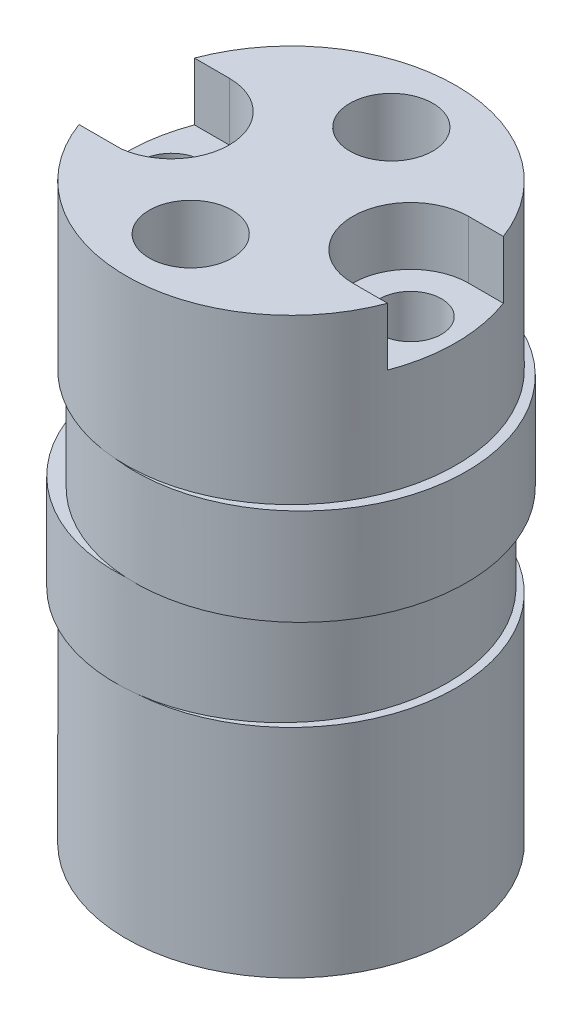
ISO-10303-21;
HEADER;
FILE_DESCRIPTION(('STEP AP214'),'2;1');
FILE_NAME('part.step','',(''),(''),'','','');
FILE_SCHEMA(('AUTOMOTIVE_DESIGN { 1 0 10303 214 1 1 1 1 }'));
ENDSEC;
DATA;
#1=APPLICATION_CONTEXT('core data for automotive mechanical design processes');
#2=APPLICATION_PROTOCOL_DEFINITION('international standard','automotive_design',2000,#1);
#3=PRODUCT_CONTEXT('',#1,'mechanical');
#4=PRODUCT('Part','Part','',(#3));
#5=PRODUCT_RELATED_PRODUCT_CATEGORY('part','',(#4));
#6=PRODUCT_DEFINITION_FORMATION('','',#4);
#7=PRODUCT_DEFINITION_CONTEXT('part definition',#1,'design');
#8=PRODUCT_DEFINITION('design','',#6,#7);
#9=PRODUCT_DEFINITION_SHAPE('','',#8);
#10=(LENGTH_UNIT() NAMED_UNIT(*) SI_UNIT(.MILLI.,.METRE.));
#11=(NAMED_UNIT(*) PLANE_ANGLE_UNIT() SI_UNIT($,.RADIAN.));
#12=(NAMED_UNIT(*) SI_UNIT($,.STERADIAN.) SOLID_ANGLE_UNIT());
#13=UNCERTAINTY_MEASURE_WITH_UNIT(LENGTH_MEASURE(1.E-05),#10,'distance_accuracy_value','');
#14=(GEOMETRIC_REPRESENTATION_CONTEXT(3) GLOBAL_UNCERTAINTY_ASSIGNED_CONTEXT((#13)) GLOBAL_UNIT_ASSIGNED_CONTEXT((#10,
#11,#12)) REPRESENTATION_CONTEXT('',''));
#15=CARTESIAN_POINT('',(0.,0.,0.));
#16=DIRECTION('',(0.,0.,1.));
#17=DIRECTION('',(1.,0.,0.));
#18=AXIS2_PLACEMENT_3D('',#15,#16,#17);
#19=CARTESIAN_POINT('',(6.7,-15.7754833995939,0.));
#20=DIRECTION('',(0.,1.,0.));
#21=DIRECTION('',(0.,0.,1.));
#22=AXIS2_PLACEMENT_3D('',#19,#20,#21);
#23=CYLINDRICAL_SURFACE('',#22,1.6);
#24=CARTESIAN_POINT('',(6.7,-11.25,0.));
#25=DIRECTION('',(0.,-1.,0.));
#26=DIRECTION('',(0.,0.,-1.));
#27=AXIS2_PLACEMENT_3D('',#24,#25,#26);
#28=CIRCLE('',#27,1.6);
#29=CARTESIAN_POINT('',(6.7,-11.25,-1.6));
#30=VERTEX_POINT('',#29);
#31=EDGE_CURVE('E214',#30,#30,#28,.F.);
#32=ORIENTED_EDGE('',*,*,#31,.F.);
#33=EDGE_LOOP('',(#32));
#34=FACE_BOUND('',#33,.T.);
#35=CARTESIAN_POINT('',(6.7,15.5,0.));
#36=DIRECTION('',(0.,1.,0.));
#37=DIRECTION('',(0.,0.,1.));
#38=AXIS2_PLACEMENT_3D('',#35,#36,#37);
#39=CIRCLE('',#38,1.6);
#40=CARTESIAN_POINT('',(6.7,15.5,1.6));
#41=VERTEX_POINT('',#40);
#42=EDGE_CURVE('E43',#41,#41,#39,.F.);
#43=ORIENTED_EDGE('',*,*,#42,.F.);
#44=EDGE_LOOP('',(#43));
#45=FACE_BOUND('',#44,.T.);
#46=ADVANCED_FACE('F39',(#34,#45),#23,.F.);
#47=CARTESIAN_POINT('',(-5.7,-15.7754833995939,0.));
#48=DIRECTION('',(0.,1.,0.));
#49=DIRECTION('',(0.,0.,1.));
#50=AXIS2_PLACEMENT_3D('',#47,#48,#49);
#51=CYLINDRICAL_SURFACE('',#50,1.6);
#52=CARTESIAN_POINT('',(-5.7,-11.25,0.));
#53=DIRECTION('',(0.,-1.,0.));
#54=DIRECTION('',(0.,0.,-1.));
#55=AXIS2_PLACEMENT_3D('',#52,#53,#54);
#56=CIRCLE('',#55,1.6);
#57=CARTESIAN_POINT('',(-5.7,-11.25,-1.6));
#58=VERTEX_POINT('',#57);
#59=EDGE_CURVE('E203',#58,#58,#56,.F.);
#60=ORIENTED_EDGE('',*,*,#59,.F.);
#61=EDGE_LOOP('',(#60));
#62=FACE_BOUND('',#61,.T.);
#63=CARTESIAN_POINT('',(-5.7,15.5,0.));
#64=DIRECTION('',(0.,1.,0.));
#65=DIRECTION('',(0.,0.,1.));
#66=AXIS2_PLACEMENT_3D('',#63,#64,#65);
#67=CIRCLE('',#66,1.6);
#68=CARTESIAN_POINT('',(-5.7,15.5,1.6));
#69=VERTEX_POINT('',#68);
#70=EDGE_CURVE('E154',#69,#69,#67,.F.);
#71=ORIENTED_EDGE('',*,*,#70,.F.);
#72=EDGE_LOOP('',(#71));
#73=FACE_BOUND('',#72,.T.);
#74=ADVANCED_FACE('F252',(#62,#73),#51,.F.);
#75=CARTESIAN_POINT('',(0.,5.,0.));
#76=DIRECTION('',(0.,-1.,0.));
#77=DIRECTION('',(0.,0.,-1.));
#78=AXIS2_PLACEMENT_3D('',#75,#76,#77);
#79=CYLINDRICAL_SURFACE('',#78,8.6);
#80=CARTESIAN_POINT('',(0.,5.,0.));
#81=DIRECTION('',(0.,1.,0.));
#82=DIRECTION('',(0.,0.,1.));
#83=AXIS2_PLACEMENT_3D('',#80,#81,#82);
#84=CIRCLE('',#83,8.6);
#85=CARTESIAN_POINT('',(0.500000000000015,5.,8.58545281275251));
#86=VERTEX_POINT('',#85);
#87=CARTESIAN_POINT('',(0.500000000000015,5.,-8.58545281275251));
#88=VERTEX_POINT('',#87);
#89=EDGE_CURVE('E243',#86,#88,#84,.T.);
#90=ORIENTED_EDGE('',*,*,#89,.F.);
#91=EDGE_CURVE('E246',#88,#86,#84,.T.);
#92=ORIENTED_EDGE('',*,*,#91,.F.);
#93=EDGE_LOOP('',(#90,#92));
#94=FACE_BOUND('',#93,.T.);
#95=CARTESIAN_POINT('',(0.,0.,0.));
#96=DIRECTION('',(0.,1.,0.));
#97=DIRECTION('',(0.,0.,1.));
#98=AXIS2_PLACEMENT_3D('',#95,#96,#97);
#99=CIRCLE('',#98,8.6);
#100=CARTESIAN_POINT('',(1.10749999999999,0.,8.52839045482792));
#101=VERTEX_POINT('',#100);
#102=CARTESIAN_POINT('',(1.10749999999999,0.,-8.52839045482792));
#103=VERTEX_POINT('',#102);
#104=EDGE_CURVE('E247',#101,#103,#99,.T.);
#105=ORIENTED_EDGE('',*,*,#104,.T.);
#106=EDGE_CURVE('E238',#103,#101,#99,.T.);
#107=ORIENTED_EDGE('',*,*,#106,.T.);
#108=EDGE_LOOP('',(#105,#107));
#109=FACE_BOUND('',#108,.T.);
#110=ADVANCED_FACE('F41',(#94,#109),#79,.T.);
#111=CARTESIAN_POINT('',(0.,5.,0.));
#112=DIRECTION('',(0.,1.,0.));
#113=DIRECTION('',(0.,0.,1.));
#114=AXIS2_PLACEMENT_3D('',#111,#112,#113);
#115=PLANE('',#114);
#116=CARTESIAN_POINT('',(1.,5.,0.));
#117=DIRECTION('',(0.,1.,0.));
#118=DIRECTION('',(0.,0.,1.));
#119=AXIS2_PLACEMENT_3D('',#116,#117,#118);
#120=CIRCLE('',#119,8.6);
#121=EDGE_CURVE('E240',#88,#86,#120,.T.);
#122=ORIENTED_EDGE('',*,*,#121,.F.);
#123=ORIENTED_EDGE('',*,*,#91,.T.);
#124=EDGE_LOOP('',(#122,#123));
#125=FACE_BOUND('',#124,.T.);
#126=ADVANCED_FACE('F261',(#125),#115,.T.);
#127=CARTESIAN_POINT('',(0.,0.,0.));
#128=DIRECTION('',(0.,1.,0.));
#129=DIRECTION('',(0.,0.,1.));
#130=AXIS2_PLACEMENT_3D('',#127,#128,#129);
#131=PLANE('',#130);
#132=CARTESIAN_POINT('',(0.5,0.,0.));
#133=DIRECTION('',(0.,-1.,0.));
#134=DIRECTION('',(0.,0.,-1.));
#135=AXIS2_PLACEMENT_3D('',#132,#133,#134);
#136=CIRCLE('',#135,8.55);
#137=EDGE_CURVE('E11',#101,#103,#136,.T.);
#138=ORIENTED_EDGE('',*,*,#137,.F.);
#139=ORIENTED_EDGE('',*,*,#106,.F.);
#140=EDGE_LOOP('',(#138,#139));
#141=FACE_BOUND('',#140,.T.);
#142=ADVANCED_FACE('F313',(#141),#131,.F.);
#143=CARTESIAN_POINT('',(1.,5.,0.));
#144=DIRECTION('',(0.,1.,0.));
#145=DIRECTION('',(0.,0.,1.));
#146=AXIS2_PLACEMENT_3D('',#143,#144,#145);
#147=PLANE('',#146);
#148=EDGE_CURVE('E234',#86,#88,#120,.T.);
#149=ORIENTED_EDGE('',*,*,#148,.F.);
#150=ORIENTED_EDGE('',*,*,#89,.T.);
#151=EDGE_LOOP('',(#149,#150));
#152=FACE_BOUND('',#151,.T.);
#153=ADVANCED_FACE('F310',(#152),#147,.F.);
#154=CARTESIAN_POINT('',(1.,10.,0.));
#155=DIRECTION('',(0.,-1.,0.));
#156=DIRECTION('',(0.,0.,-1.));
#157=AXIS2_PLACEMENT_3D('',#154,#155,#156);
#158=CYLINDRICAL_SURFACE('',#157,8.6);
#159=CARTESIAN_POINT('',(1.,10.,0.));
#160=DIRECTION('',(0.,1.,0.));
#161=DIRECTION('',(0.,0.,1.));
#162=AXIS2_PLACEMENT_3D('',#159,#160,#161);
#163=CIRCLE('',#162,8.6);
#164=CARTESIAN_POINT('',(-0.107499999999965,10.,-8.52839045482792));
#165=VERTEX_POINT('',#164);
#166=CARTESIAN_POINT('',(-0.107499999999965,10.,8.52839045482792));
#167=VERTEX_POINT('',#166);
#168=EDGE_CURVE('E235',#165,#167,#163,.T.);
#169=ORIENTED_EDGE('',*,*,#168,.F.);
#170=EDGE_CURVE('E239',#167,#165,#163,.T.);
#171=ORIENTED_EDGE('',*,*,#170,.F.);
#172=EDGE_LOOP('',(#169,#171));
#173=FACE_BOUND('',#172,.T.);
#174=ORIENTED_EDGE('',*,*,#121,.T.);
#175=ORIENTED_EDGE('',*,*,#148,.T.);
#176=EDGE_LOOP('',(#174,#175));
#177=FACE_BOUND('',#176,.T.);
#178=ADVANCED_FACE('F308',(#173,#177),#158,.T.);
#179=CARTESIAN_POINT('',(1.,10.,0.));
#180=DIRECTION('',(0.,1.,0.));
#181=DIRECTION('',(0.,0.,1.));
#182=AXIS2_PLACEMENT_3D('',#179,#180,#181);
#183=PLANE('',#182);
#184=CARTESIAN_POINT('',(0.5,10.,0.));
#185=DIRECTION('',(0.,1.,0.));
#186=DIRECTION('',(0.,0.,1.));
#187=AXIS2_PLACEMENT_3D('',#184,#185,#186);
#188=CIRCLE('',#187,8.55);
#189=EDGE_CURVE('E48',#167,#165,#188,.T.);
#190=ORIENTED_EDGE('',*,*,#189,.F.);
#191=ORIENTED_EDGE('',*,*,#170,.T.);
#192=EDGE_LOOP('',(#190,#191));
#193=FACE_BOUND('',#192,.T.);
#194=ADVANCED_FACE('F302',(#193),#183,.T.);
#195=CARTESIAN_POINT('',(0.5,10.,0.));
#196=DIRECTION('',(0.,1.,0.));
#197=DIRECTION('',(0.,0.,1.));
#198=AXIS2_PLACEMENT_3D('',#195,#196,#197);
#199=PLANE('',#198);
#200=EDGE_CURVE('E231',#165,#167,#188,.T.);
#201=ORIENTED_EDGE('',*,*,#200,.F.);
#202=ORIENTED_EDGE('',*,*,#168,.T.);
#203=EDGE_LOOP('',(#201,#202));
#204=FACE_BOUND('',#203,.T.);
#205=ADVANCED_FACE('F299',(#204),#199,.F.);
#206=CARTESIAN_POINT('',(0.5,11.,0.));
#207=DIRECTION('',(0.,-1.,0.));
#208=DIRECTION('',(0.,0.,-1.));
#209=AXIS2_PLACEMENT_3D('',#206,#207,#208);
#210=CYLINDRICAL_SURFACE('',#209,8.55);
#211=CARTESIAN_POINT('',(0.5,18.5,0.));
#212=DIRECTION('',(0.,1.,0.));
#213=DIRECTION('',(0.,0.,1.));
#214=AXIS2_PLACEMENT_3D('',#211,#212,#213);
#215=CIRCLE('',#214,8.55);
#216=CARTESIAN_POINT('',(-7.51621514432931,18.5,2.9736837020479));
#217=VERTEX_POINT('',#216);
#218=CARTESIAN_POINT('',(8.50640368704951,18.5,3.));
#219=VERTEX_POINT('',#218);
#220=EDGE_CURVE('E225',#217,#219,#215,.T.);
#221=ORIENTED_EDGE('',*,*,#220,.F.);
#222=DIRECTION('',(0.,-1.,0.));
#223=VECTOR('',#222,1.);
#224=CARTESIAN_POINT('',(-7.51621514432932,11.,2.9736837020479));
#225=LINE('',#224,#223);
#226=CARTESIAN_POINT('',(-7.51621514432931,15.5,2.9736837020479));
#227=VERTEX_POINT('',#226);
#228=EDGE_CURVE('E184',#217,#227,#225,.T.);
#229=ORIENTED_EDGE('',*,*,#228,.T.);
#230=CARTESIAN_POINT('',(0.5,15.5,0.));
#231=DIRECTION('',(0.,1.,0.));
#232=DIRECTION('',(0.,0.,1.));
#233=AXIS2_PLACEMENT_3D('',#230,#231,#232);
#234=CIRCLE('',#233,8.55);
#235=CARTESIAN_POINT('',(-7.50640368704951,15.5,-3.));
#236=VERTEX_POINT('',#235);
#237=EDGE_CURVE('E173',#236,#227,#234,.T.);
#238=ORIENTED_EDGE('',*,*,#237,.F.);
#239=DIRECTION('',(0.,-1.,0.));
#240=VECTOR('',#239,1.);
#241=CARTESIAN_POINT('',(-7.50640368704951,11.,-3.));
#242=LINE('',#241,#240);
#243=CARTESIAN_POINT('',(-7.50640368704951,18.5,-3.));
#244=VERTEX_POINT('',#243);
#245=EDGE_CURVE('E139',#236,#244,#242,.F.);
#246=ORIENTED_EDGE('',*,*,#245,.T.);
#247=CARTESIAN_POINT('',(8.50640368704951,18.5,-3.));
#248=VERTEX_POINT('',#247);
#249=EDGE_CURVE('E230',#248,#244,#215,.T.);
#250=ORIENTED_EDGE('',*,*,#249,.F.);
#251=DIRECTION('',(0.,-1.,0.));
#252=VECTOR('',#251,1.);
#253=CARTESIAN_POINT('',(8.50640368704951,11.,-3.));
#254=LINE('',#253,#252);
#255=CARTESIAN_POINT('',(8.50640368704951,15.5,-3.));
#256=VERTEX_POINT('',#255);
#257=EDGE_CURVE('E180',#248,#256,#254,.T.);
#258=ORIENTED_EDGE('',*,*,#257,.T.);
#259=CARTESIAN_POINT('',(0.5,15.5,0.));
#260=DIRECTION('',(0.,1.,0.));
#261=DIRECTION('',(0.,0.,1.));
#262=AXIS2_PLACEMENT_3D('',#259,#260,#261);
#263=CIRCLE('',#262,8.55);
#264=CARTESIAN_POINT('',(8.50640368704951,15.5,3.));
#265=VERTEX_POINT('',#264);
#266=EDGE_CURVE('E175',#265,#256,#263,.T.);
#267=ORIENTED_EDGE('',*,*,#266,.F.);
#268=DIRECTION('',(0.,-1.,0.));
#269=VECTOR('',#268,1.);
#270=CARTESIAN_POINT('',(8.50640368704951,11.,3.));
#271=LINE('',#270,#269);
#272=EDGE_CURVE('E177',#265,#219,#271,.F.);
#273=ORIENTED_EDGE('',*,*,#272,.T.);
#274=EDGE_LOOP('',(#221,#229,#238,#246,#250,#258,#267,#273));
#275=FACE_BOUND('',#274,.T.);
#276=ORIENTED_EDGE('',*,*,#200,.T.);
#277=ORIENTED_EDGE('',*,*,#189,.T.);
#278=EDGE_LOOP('',(#276,#277));
#279=FACE_BOUND('',#278,.T.);
#280=ADVANCED_FACE('F297',(#275,#279),#210,.T.);
#281=CARTESIAN_POINT('',(0.5,18.5,0.));
#282=DIRECTION('',(0.,1.,0.));
#283=DIRECTION('',(0.,0.,1.));
#284=AXIS2_PLACEMENT_3D('',#281,#282,#283);
#285=PLANE('',#284);
#286=DIRECTION('',(1.,0.,0.));
#287=VECTOR('',#286,1.);
#288=CARTESIAN_POINT('',(-5.30350883972695,18.5,2.9736837020479));
#289=LINE('',#288,#287);
#290=CARTESIAN_POINT('',(-5.30350883972695,18.5,2.9736837020479));
#291=VERTEX_POINT('',#290);
#292=EDGE_CURVE('E146',#217,#291,#289,.T.);
#293=ORIENTED_EDGE('',*,*,#292,.F.);
#294=ORIENTED_EDGE('',*,*,#220,.T.);
#295=DIRECTION('',(1.,0.,0.));
#296=VECTOR('',#295,1.);
#297=CARTESIAN_POINT('',(6.7,18.5,3.));
#298=LINE('',#297,#296);
#299=CARTESIAN_POINT('',(6.7,18.5,3.));
#300=VERTEX_POINT('',#299);
#301=EDGE_CURVE('E163',#300,#219,#298,.T.);
#302=ORIENTED_EDGE('',*,*,#301,.F.);
#303=CARTESIAN_POINT('',(6.7,18.5,0.));
#304=DIRECTION('',(0.,1.,0.));
#305=DIRECTION('',(0.,0.,1.));
#306=AXIS2_PLACEMENT_3D('',#303,#304,#305);
#307=CIRCLE('',#306,3.);
#308=CARTESIAN_POINT('',(6.7,18.5,-3.));
#309=VERTEX_POINT('',#308);
#310=EDGE_CURVE('E65',#309,#300,#307,.T.);
#311=ORIENTED_EDGE('',*,*,#310,.F.);
#312=DIRECTION('',(-1.,0.,0.));
#313=VECTOR('',#312,1.);
#314=CARTESIAN_POINT('',(6.7,18.5,-3.));
#315=LINE('',#314,#313);
#316=EDGE_CURVE('E161',#248,#309,#315,.T.);
#317=ORIENTED_EDGE('',*,*,#316,.F.);
#318=ORIENTED_EDGE('',*,*,#249,.T.);
#319=DIRECTION('',(-1.,0.,0.));
#320=VECTOR('',#319,1.);
#321=CARTESIAN_POINT('',(-5.7,18.5,-3.));
#322=LINE('',#321,#320);
#323=CARTESIAN_POINT('',(-5.7,18.5,-3.));
#324=VERTEX_POINT('',#323);
#325=EDGE_CURVE('E148',#324,#244,#322,.T.);
#326=ORIENTED_EDGE('',*,*,#325,.F.);
#327=CARTESIAN_POINT('',(-5.7,18.5,0.));
#328=DIRECTION('',(0.,1.,0.));
#329=DIRECTION('',(0.,0.,1.));
#330=AXIS2_PLACEMENT_3D('',#327,#328,#329);
#331=CIRCLE('',#330,3.);
#332=EDGE_CURVE('E57',#291,#324,#331,.T.);
#333=ORIENTED_EDGE('',*,*,#332,.F.);
#334=EDGE_LOOP('',(#293,#294,#302,#311,#317,#318,#326,#333));
#335=FACE_BOUND('',#334,.T.);
#336=CARTESIAN_POINT('',(0.3,18.5,5.));
#337=DIRECTION('',(0.,1.,0.));
#338=DIRECTION('',(0.,0.,-1.));
#339=AXIS2_PLACEMENT_3D('',#336,#337,#338);
#340=CIRCLE('',#339,2.15);
#341=CARTESIAN_POINT('',(0.3,18.5,2.85));
#342=VERTEX_POINT('',#341);
#343=EDGE_CURVE('E199',#342,#342,#340,.T.);
#344=ORIENTED_EDGE('',*,*,#343,.F.);
#345=EDGE_LOOP('',(#344));
#346=FACE_BOUND('',#345,.T.);
#347=CARTESIAN_POINT('',(0.7,18.5,-5.));
#348=DIRECTION('',(0.,1.,0.));
#349=DIRECTION('',(0.,0.,1.));
#350=AXIS2_PLACEMENT_3D('',#347,#348,#349);
#351=CIRCLE('',#350,2.15);
#352=CARTESIAN_POINT('',(0.7,18.5,-2.85));
#353=VERTEX_POINT('',#352);
#354=EDGE_CURVE('E219',#353,#353,#351,.T.);
#355=ORIENTED_EDGE('',*,*,#354,.F.);
#356=EDGE_LOOP('',(#355));
#357=FACE_BOUND('',#356,.T.);
#358=ADVANCED_FACE('F293',(#335,#346,#357),#285,.T.);
#359=CARTESIAN_POINT('',(0.7,11.5,-5.));
#360=DIRECTION('',(0.,1.,0.));
#361=DIRECTION('',(0.,0.,1.));
#362=AXIS2_PLACEMENT_3D('',#359,#360,#361);
#363=CYLINDRICAL_SURFACE('',#362,2.15);
#364=CARTESIAN_POINT('',(0.7,11.5,-5.));
#365=DIRECTION('',(0.,1.,0.));
#366=DIRECTION('',(0.,0.,1.));
#367=AXIS2_PLACEMENT_3D('',#364,#365,#366);
#368=CIRCLE('',#367,2.15);
#369=CARTESIAN_POINT('',(0.7,11.5,-2.85));
#370=VERTEX_POINT('',#369);
#371=EDGE_CURVE('E222',#370,#370,#368,.T.);
#372=ORIENTED_EDGE('',*,*,#371,.F.);
#373=EDGE_LOOP('',(#372));
#374=FACE_BOUND('',#373,.T.);
#375=ORIENTED_EDGE('',*,*,#354,.T.);
#376=EDGE_LOOP('',(#375));
#377=FACE_BOUND('',#376,.T.);
#378=ADVANCED_FACE('F289',(#374,#377),#363,.F.);
#379=CARTESIAN_POINT('',(0.7,11.5,-5.));
#380=DIRECTION('',(0.,1.,0.));
#381=DIRECTION('',(0.,0.,1.));
#382=AXIS2_PLACEMENT_3D('',#379,#380,#381);
#383=PLANE('',#382);
#384=CARTESIAN_POINT('',(0.7,11.5,-5.));
#385=DIRECTION('',(0.,1.,0.));
#386=DIRECTION('',(0.,0.,1.));
#387=AXIS2_PLACEMENT_3D('',#384,#385,#386);
#388=CIRCLE('',#387,1.5);
#389=CARTESIAN_POINT('',(0.7,11.5,-3.5));
#390=VERTEX_POINT('',#389);
#391=EDGE_CURVE('E208',#390,#390,#388,.T.);
#392=ORIENTED_EDGE('',*,*,#391,.F.);
#393=EDGE_LOOP('',(#392));
#394=FACE_BOUND('',#393,.T.);
#395=ORIENTED_EDGE('',*,*,#371,.T.);
#396=EDGE_LOOP('',(#395));
#397=FACE_BOUND('',#396,.T.);
#398=ADVANCED_FACE('F285',(#394,#397),#383,.T.);
#399=CARTESIAN_POINT('',(0.5,-11.25,0.));
#400=DIRECTION('',(0.,1.,0.));
#401=DIRECTION('',(0.,0.,1.));
#402=AXIS2_PLACEMENT_3D('',#399,#400,#401);
#403=CYLINDRICAL_SURFACE('',#402,8.55);
#404=CARTESIAN_POINT('',(0.5,-11.25,0.));
#405=DIRECTION('',(0.,-1.,0.));
#406=DIRECTION('',(0.,0.,-1.));
#407=AXIS2_PLACEMENT_3D('',#404,#405,#406);
#408=CIRCLE('',#407,8.55);
#409=CARTESIAN_POINT('',(0.5,-11.25,-8.55));
#410=VERTEX_POINT('',#409);
#411=EDGE_CURVE('E217',#410,#410,#408,.T.);
#412=ORIENTED_EDGE('',*,*,#411,.F.);
#413=EDGE_LOOP('',(#412));
#414=FACE_BOUND('',#413,.T.);
#415=EDGE_CURVE('E50',#103,#101,#136,.T.);
#416=ORIENTED_EDGE('',*,*,#415,.T.);
#417=ORIENTED_EDGE('',*,*,#137,.T.);
#418=EDGE_LOOP('',(#416,#417));
#419=FACE_BOUND('',#418,.T.);
#420=ADVANCED_FACE('F278',(#414,#419),#403,.T.);
#421=CARTESIAN_POINT('',(0.5,-11.25,0.));
#422=DIRECTION('',(0.,-1.,0.));
#423=DIRECTION('',(0.,0.,-1.));
#424=AXIS2_PLACEMENT_3D('',#421,#422,#423);
#425=PLANE('',#424);
#426=CARTESIAN_POINT('',(0.7,-11.25,0.));
#427=DIRECTION('',(0.,-1.,0.));
#428=DIRECTION('',(0.,0.,-1.));
#429=AXIS2_PLACEMENT_3D('',#426,#427,#428);
#430=CIRCLE('',#429,2.1);
#431=CARTESIAN_POINT('',(0.7,-11.25,-2.1));
#432=VERTEX_POINT('',#431);
#433=EDGE_CURVE('E187',#432,#432,#430,.T.);
#434=ORIENTED_EDGE('',*,*,#433,.F.);
#435=EDGE_LOOP('',(#434));
#436=FACE_BOUND('',#435,.T.);
#437=CARTESIAN_POINT('',(0.3,-11.25,5.));
#438=DIRECTION('',(0.,-1.,0.));
#439=DIRECTION('',(0.,0.,-1.));
#440=AXIS2_PLACEMENT_3D('',#437,#438,#439);
#441=CIRCLE('',#440,1.5);
#442=CARTESIAN_POINT('',(0.3,-11.25,3.5));
#443=VERTEX_POINT('',#442);
#444=EDGE_CURVE('E196',#443,#443,#441,.F.);
#445=ORIENTED_EDGE('',*,*,#444,.T.);
#446=EDGE_LOOP('',(#445));
#447=FACE_BOUND('',#446,.T.);
#448=ORIENTED_EDGE('',*,*,#59,.T.);
#449=EDGE_LOOP('',(#448));
#450=FACE_BOUND('',#449,.T.);
#451=CARTESIAN_POINT('',(0.7,-11.25,-5.));
#452=DIRECTION('',(0.,-1.,0.));
#453=DIRECTION('',(0.,0.,-1.));
#454=AXIS2_PLACEMENT_3D('',#451,#452,#453);
#455=CIRCLE('',#454,1.5);
#456=CARTESIAN_POINT('',(0.7,-11.25,-6.5));
#457=VERTEX_POINT('',#456);
#458=EDGE_CURVE('E211',#457,#457,#455,.F.);
#459=ORIENTED_EDGE('',*,*,#458,.T.);
#460=EDGE_LOOP('',(#459));
#461=FACE_BOUND('',#460,.T.);
#462=ORIENTED_EDGE('',*,*,#31,.T.);
#463=EDGE_LOOP('',(#462));
#464=FACE_BOUND('',#463,.T.);
#465=ORIENTED_EDGE('',*,*,#411,.T.);
#466=EDGE_LOOP('',(#465));
#467=FACE_BOUND('',#466,.T.);
#468=ADVANCED_FACE('F275',(#436,#447,#450,#461,#464,#467),#425,.T.);
#469=CARTESIAN_POINT('',(0.5,0.,0.));
#470=DIRECTION('',(0.,-1.,0.));
#471=DIRECTION('',(0.,0.,-1.));
#472=AXIS2_PLACEMENT_3D('',#469,#470,#471);
#473=PLANE('',#472);
#474=ORIENTED_EDGE('',*,*,#104,.F.);
#475=ORIENTED_EDGE('',*,*,#415,.F.);
#476=EDGE_LOOP('',(#474,#475));
#477=FACE_BOUND('',#476,.T.);
#478=ADVANCED_FACE('F272',(#477),#473,.F.);
#479=CARTESIAN_POINT('',(0.7,-15.4926406871193,-5.));
#480=DIRECTION('',(0.,1.,0.));
#481=DIRECTION('',(0.,0.,1.));
#482=AXIS2_PLACEMENT_3D('',#479,#480,#481);
#483=CYLINDRICAL_SURFACE('',#482,1.5);
#484=ORIENTED_EDGE('',*,*,#391,.T.);
#485=EDGE_LOOP('',(#484));
#486=FACE_BOUND('',#485,.T.);
#487=ORIENTED_EDGE('',*,*,#458,.F.);
#488=EDGE_LOOP('',(#487));
#489=FACE_BOUND('',#488,.T.);
#490=ADVANCED_FACE('F270',(#486,#489),#483,.F.);
#491=CARTESIAN_POINT('',(0.3,11.5,5.));
#492=DIRECTION('',(0.,1.,0.));
#493=DIRECTION('',(0.,0.,1.));
#494=AXIS2_PLACEMENT_3D('',#491,#492,#493);
#495=CYLINDRICAL_SURFACE('',#494,2.15);
#496=CARTESIAN_POINT('',(0.3,11.5,5.));
#497=DIRECTION('',(0.,1.,0.));
#498=DIRECTION('',(0.,0.,-1.));
#499=AXIS2_PLACEMENT_3D('',#496,#497,#498);
#500=CIRCLE('',#499,2.15);
#501=CARTESIAN_POINT('',(0.3,11.5,2.85));
#502=VERTEX_POINT('',#501);
#503=EDGE_CURVE('E200',#502,#502,#500,.T.);
#504=ORIENTED_EDGE('',*,*,#503,.F.);
#505=EDGE_LOOP('',(#504));
#506=FACE_BOUND('',#505,.T.);
#507=ORIENTED_EDGE('',*,*,#343,.T.);
#508=EDGE_LOOP('',(#507));
#509=FACE_BOUND('',#508,.T.);
#510=ADVANCED_FACE('F268',(#506,#509),#495,.F.);
#511=CARTESIAN_POINT('',(0.3,11.5,5.));
#512=DIRECTION('',(0.,1.,0.));
#513=DIRECTION('',(0.,0.,-1.));
#514=AXIS2_PLACEMENT_3D('',#511,#512,#513);
#515=PLANE('',#514);
#516=CARTESIAN_POINT('',(0.3,11.5,5.));
#517=DIRECTION('',(0.,1.,0.));
#518=DIRECTION('',(0.,0.,-1.));
#519=AXIS2_PLACEMENT_3D('',#516,#517,#518);
#520=CIRCLE('',#519,1.5);
#521=CARTESIAN_POINT('',(0.3,11.5,3.5));
#522=VERTEX_POINT('',#521);
#523=EDGE_CURVE('E191',#522,#522,#520,.T.);
#524=ORIENTED_EDGE('',*,*,#523,.F.);
#525=EDGE_LOOP('',(#524));
#526=FACE_BOUND('',#525,.T.);
#527=ORIENTED_EDGE('',*,*,#503,.T.);
#528=EDGE_LOOP('',(#527));
#529=FACE_BOUND('',#528,.T.);
#530=ADVANCED_FACE('F363',(#526,#529),#515,.T.);
#531=CARTESIAN_POINT('',(0.3,-15.4926406871193,5.));
#532=DIRECTION('',(0.,1.,0.));
#533=DIRECTION('',(0.,0.,1.));
#534=AXIS2_PLACEMENT_3D('',#531,#532,#533);
#535=CYLINDRICAL_SURFACE('',#534,1.5);
#536=ORIENTED_EDGE('',*,*,#523,.T.);
#537=EDGE_LOOP('',(#536));
#538=FACE_BOUND('',#537,.T.);
#539=ORIENTED_EDGE('',*,*,#444,.F.);
#540=EDGE_LOOP('',(#539));
#541=FACE_BOUND('',#540,.T.);
#542=ADVANCED_FACE('F371',(#538,#541),#535,.F.);
#543=CARTESIAN_POINT('',(0.7,-5.45,0.));
#544=DIRECTION('',(0.,-1.,0.));
#545=DIRECTION('',(0.,0.,-1.));
#546=AXIS2_PLACEMENT_3D('',#543,#544,#545);
#547=CYLINDRICAL_SURFACE('',#546,2.1);
#548=CARTESIAN_POINT('',(0.7,-5.45,0.));
#549=DIRECTION('',(0.,-1.,0.));
#550=DIRECTION('',(0.,0.,-1.));
#551=AXIS2_PLACEMENT_3D('',#548,#549,#550);
#552=CIRCLE('',#551,2.1);
#553=CARTESIAN_POINT('',(0.7,-5.45,-2.1));
#554=VERTEX_POINT('',#553);
#555=EDGE_CURVE('E188',#554,#554,#552,.T.);
#556=ORIENTED_EDGE('',*,*,#555,.F.);
#557=EDGE_LOOP('',(#556));
#558=FACE_BOUND('',#557,.T.);
#559=ORIENTED_EDGE('',*,*,#433,.T.);
#560=EDGE_LOOP('',(#559));
#561=FACE_BOUND('',#560,.T.);
#562=ADVANCED_FACE('F378',(#558,#561),#547,.F.);
#563=CARTESIAN_POINT('',(0.7,-5.45,0.));
#564=DIRECTION('',(0.,-1.,0.));
#565=DIRECTION('',(0.,0.,-1.));
#566=AXIS2_PLACEMENT_3D('',#563,#564,#565);
#567=PLANE('',#566);
#568=ORIENTED_EDGE('',*,*,#555,.T.);
#569=EDGE_LOOP('',(#568));
#570=FACE_BOUND('',#569,.T.);
#571=ADVANCED_FACE('F392',(#570),#567,.T.);
#572=CARTESIAN_POINT('',(-5.30350883972695,15.5,2.9736837020479));
#573=DIRECTION('',(0.,0.,1.));
#574=DIRECTION('',(1.,0.,0.));
#575=AXIS2_PLACEMENT_3D('',#572,#573,#574);
#576=PLANE('',#575);
#577=ORIENTED_EDGE('',*,*,#292,.T.);
#578=DIRECTION('',(0.,1.,0.));
#579=VECTOR('',#578,1.);
#580=CARTESIAN_POINT('',(-5.30350883972695,15.5,2.9736837020479));
#581=LINE('',#580,#579);
#582=CARTESIAN_POINT('',(-5.30350883972695,15.5,2.9736837020479));
#583=VERTEX_POINT('',#582);
#584=EDGE_CURVE('E132',#583,#291,#581,.T.);
#585=ORIENTED_EDGE('',*,*,#584,.F.);
#586=DIRECTION('',(1.,0.,0.));
#587=VECTOR('',#586,1.);
#588=CARTESIAN_POINT('',(-5.30350883972695,15.5,2.9736837020479));
#589=LINE('',#588,#587);
#590=EDGE_CURVE('E133',#227,#583,#589,.T.);
#591=ORIENTED_EDGE('',*,*,#590,.F.);
#592=ORIENTED_EDGE('',*,*,#228,.F.);
#593=EDGE_LOOP('',(#577,#585,#591,#592));
#594=FACE_BOUND('',#593,.T.);
#595=ADVANCED_FACE('F400',(#594),#576,.F.);
#596=CARTESIAN_POINT('',(-5.7,15.5,-3.));
#597=DIRECTION('',(0.,0.,-1.));
#598=DIRECTION('',(-1.,0.,0.));
#599=AXIS2_PLACEMENT_3D('',#596,#597,#598);
#600=PLANE('',#599);
#601=DIRECTION('',(-1.,0.,0.));
#602=VECTOR('',#601,1.);
#603=CARTESIAN_POINT('',(-5.7,15.5,-3.));
#604=LINE('',#603,#602);
#605=CARTESIAN_POINT('',(-5.7,15.5,-3.));
#606=VERTEX_POINT('',#605);
#607=EDGE_CURVE('E136',#606,#236,#604,.T.);
#608=ORIENTED_EDGE('',*,*,#607,.F.);
#609=DIRECTION('',(0.,1.,0.));
#610=VECTOR('',#609,1.);
#611=CARTESIAN_POINT('',(-5.7,15.5,-3.));
#612=LINE('',#611,#610);
#613=EDGE_CURVE('E125',#606,#324,#612,.T.);
#614=ORIENTED_EDGE('',*,*,#613,.T.);
#615=ORIENTED_EDGE('',*,*,#325,.T.);
#616=ORIENTED_EDGE('',*,*,#245,.F.);
#617=EDGE_LOOP('',(#608,#614,#615,#616));
#618=FACE_BOUND('',#617,.T.);
#619=ADVANCED_FACE('F137',(#618),#600,.F.);
#620=CARTESIAN_POINT('',(-5.7,15.5,0.));
#621=DIRECTION('',(0.,1.,0.));
#622=DIRECTION('',(0.,0.,1.));
#623=AXIS2_PLACEMENT_3D('',#620,#621,#622);
#624=PLANE('',#623);
#625=ORIENTED_EDGE('',*,*,#70,.T.);
#626=EDGE_LOOP('',(#625));
#627=FACE_BOUND('',#626,.T.);
#628=ORIENTED_EDGE('',*,*,#237,.T.);
#629=ORIENTED_EDGE('',*,*,#590,.T.);
#630=CARTESIAN_POINT('',(-5.7,15.5,0.));
#631=DIRECTION('',(0.,1.,0.));
#632=DIRECTION('',(0.,0.,1.));
#633=AXIS2_PLACEMENT_3D('',#630,#631,#632);
#634=CIRCLE('',#633,3.);
#635=EDGE_CURVE('E129',#583,#606,#634,.T.);
#636=ORIENTED_EDGE('',*,*,#635,.T.);
#637=ORIENTED_EDGE('',*,*,#607,.T.);
#638=EDGE_LOOP('',(#628,#629,#636,#637));
#639=FACE_BOUND('',#638,.T.);
#640=ADVANCED_FACE('F143',(#627,#639),#624,.T.);
#641=CARTESIAN_POINT('',(-5.7,15.5,0.));
#642=DIRECTION('',(0.,1.,0.));
#643=DIRECTION('',(0.,0.,1.));
#644=AXIS2_PLACEMENT_3D('',#641,#642,#643);
#645=CYLINDRICAL_SURFACE('',#644,3.);
#646=ORIENTED_EDGE('',*,*,#332,.T.);
#647=ORIENTED_EDGE('',*,*,#613,.F.);
#648=ORIENTED_EDGE('',*,*,#635,.F.);
#649=ORIENTED_EDGE('',*,*,#584,.T.);
#650=EDGE_LOOP('',(#646,#647,#648,#649));
#651=FACE_BOUND('',#650,.T.);
#652=ADVANCED_FACE('F127',(#651),#645,.F.);
#653=CARTESIAN_POINT('',(6.7,15.5,-3.));
#654=DIRECTION('',(0.,0.,-1.));
#655=DIRECTION('',(-1.,0.,0.));
#656=AXIS2_PLACEMENT_3D('',#653,#654,#655);
#657=PLANE('',#656);
#658=ORIENTED_EDGE('',*,*,#316,.T.);
#659=DIRECTION('',(0.,1.,0.));
#660=VECTOR('',#659,1.);
#661=CARTESIAN_POINT('',(6.7,15.5,-3.));
#662=LINE('',#661,#660);
#663=CARTESIAN_POINT('',(6.7,15.5,-3.));
#664=VERTEX_POINT('',#663);
#665=EDGE_CURVE('E159',#664,#309,#662,.T.);
#666=ORIENTED_EDGE('',*,*,#665,.F.);
#667=DIRECTION('',(-1.,0.,0.));
#668=VECTOR('',#667,1.);
#669=CARTESIAN_POINT('',(6.7,15.5,-3.));
#670=LINE('',#669,#668);
#671=EDGE_CURVE('E158',#256,#664,#670,.T.);
#672=ORIENTED_EDGE('',*,*,#671,.F.);
#673=ORIENTED_EDGE('',*,*,#257,.F.);
#674=EDGE_LOOP('',(#658,#666,#672,#673));
#675=FACE_BOUND('',#674,.T.);
#676=ADVANCED_FACE('F441',(#675),#657,.F.);
#677=CARTESIAN_POINT('',(6.7,15.5,3.));
#678=DIRECTION('',(0.,0.,1.));
#679=DIRECTION('',(1.,0.,0.));
#680=AXIS2_PLACEMENT_3D('',#677,#678,#679);
#681=PLANE('',#680);
#682=DIRECTION('',(1.,0.,0.));
#683=VECTOR('',#682,1.);
#684=CARTESIAN_POINT('',(6.7,15.5,3.));
#685=LINE('',#684,#683);
#686=CARTESIAN_POINT('',(6.7,15.5,3.));
#687=VERTEX_POINT('',#686);
#688=EDGE_CURVE('E168',#687,#265,#685,.T.);
#689=ORIENTED_EDGE('',*,*,#688,.F.);
#690=DIRECTION('',(0.,1.,0.));
#691=VECTOR('',#690,1.);
#692=CARTESIAN_POINT('',(6.7,15.5,3.));
#693=LINE('',#692,#691);
#694=EDGE_CURVE('E156',#687,#300,#693,.T.);
#695=ORIENTED_EDGE('',*,*,#694,.T.);
#696=ORIENTED_EDGE('',*,*,#301,.T.);
#697=ORIENTED_EDGE('',*,*,#272,.F.);
#698=EDGE_LOOP('',(#689,#695,#696,#697));
#699=FACE_BOUND('',#698,.T.);
#700=ADVANCED_FACE('F449',(#699),#681,.F.);
#701=CARTESIAN_POINT('',(6.7,15.5,0.));
#702=DIRECTION('',(0.,1.,0.));
#703=DIRECTION('',(0.,0.,1.));
#704=AXIS2_PLACEMENT_3D('',#701,#702,#703);
#705=PLANE('',#704);
#706=ORIENTED_EDGE('',*,*,#42,.T.);
#707=EDGE_LOOP('',(#706));
#708=FACE_BOUND('',#707,.T.);
#709=ORIENTED_EDGE('',*,*,#266,.T.);
#710=ORIENTED_EDGE('',*,*,#671,.T.);
#711=CARTESIAN_POINT('',(6.7,15.5,0.));
#712=DIRECTION('',(0.,1.,0.));
#713=DIRECTION('',(0.,0.,1.));
#714=AXIS2_PLACEMENT_3D('',#711,#712,#713);
#715=CIRCLE('',#714,3.);
#716=EDGE_CURVE('E164',#664,#687,#715,.T.);
#717=ORIENTED_EDGE('',*,*,#716,.T.);
#718=ORIENTED_EDGE('',*,*,#688,.T.);
#719=EDGE_LOOP('',(#709,#710,#717,#718));
#720=FACE_BOUND('',#719,.T.);
#721=ADVANCED_FACE('F458',(#708,#720),#705,.T.);
#722=CARTESIAN_POINT('',(6.7,15.5,0.));
#723=DIRECTION('',(0.,1.,0.));
#724=DIRECTION('',(0.,0.,1.));
#725=AXIS2_PLACEMENT_3D('',#722,#723,#724);
#726=CYLINDRICAL_SURFACE('',#725,3.);
#727=ORIENTED_EDGE('',*,*,#310,.T.);
#728=ORIENTED_EDGE('',*,*,#694,.F.);
#729=ORIENTED_EDGE('',*,*,#716,.F.);
#730=ORIENTED_EDGE('',*,*,#665,.T.);
#731=EDGE_LOOP('',(#727,#728,#729,#730));
#732=FACE_BOUND('',#731,.T.);
#733=ADVANCED_FACE('F467',(#732),#726,.F.);
#734=CLOSED_SHELL('',(#46,#74,#110,#126,#142,#153,#178,#194,#205,#280,#358,#378,#398,#420,#468,
#478,#490,#510,#530,#542,#562,#571,#595,#619,#640,#652,#676,#700,#721,#733));
#735=MANIFOLD_SOLID_BREP('B2',#734);
#736=ADVANCED_BREP_SHAPE_REPRESENTATION('',(#18,#735),#14);
#737=SHAPE_DEFINITION_REPRESENTATION(#9,#736);
ENDSEC;
END-ISO-10303-21;
